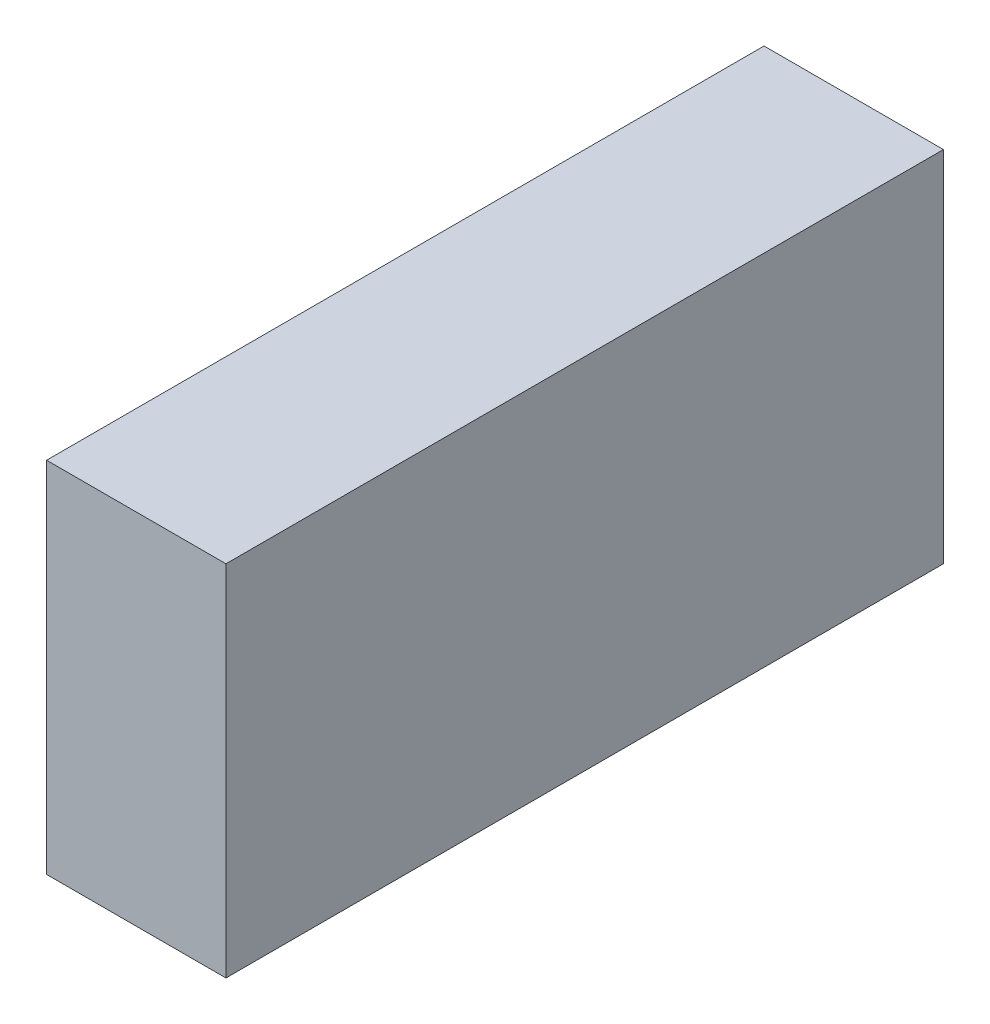
ISO-10303-21;
HEADER;
FILE_DESCRIPTION(('STEP AP214'),'2;1');
FILE_NAME('part.step','',(''),(''),'','','');
FILE_SCHEMA(('AUTOMOTIVE_DESIGN { 1 0 10303 214 1 1 1 1 }'));
ENDSEC;
DATA;
#1=APPLICATION_CONTEXT('core data for automotive mechanical design processes');
#2=APPLICATION_PROTOCOL_DEFINITION('international standard','automotive_design',2000,#1);
#3=PRODUCT_CONTEXT('',#1,'mechanical');
#4=PRODUCT('Part','Part','',(#3));
#5=PRODUCT_RELATED_PRODUCT_CATEGORY('part','',(#4));
#6=PRODUCT_DEFINITION_FORMATION('','',#4);
#7=PRODUCT_DEFINITION_CONTEXT('part definition',#1,'design');
#8=PRODUCT_DEFINITION('design','',#6,#7);
#9=PRODUCT_DEFINITION_SHAPE('','',#8);
#10=(LENGTH_UNIT() NAMED_UNIT(*) SI_UNIT(.MILLI.,.METRE.));
#11=(NAMED_UNIT(*) PLANE_ANGLE_UNIT() SI_UNIT($,.RADIAN.));
#12=(NAMED_UNIT(*) SI_UNIT($,.STERADIAN.) SOLID_ANGLE_UNIT());
#13=UNCERTAINTY_MEASURE_WITH_UNIT(LENGTH_MEASURE(1.E-05),#10,'distance_accuracy_value','');
#14=(GEOMETRIC_REPRESENTATION_CONTEXT(3) GLOBAL_UNCERTAINTY_ASSIGNED_CONTEXT((#13)) GLOBAL_UNIT_ASSIGNED_CONTEXT((#10,
#11,#12)) REPRESENTATION_CONTEXT('',''));
#15=CARTESIAN_POINT('',(0.,0.,0.));
#16=DIRECTION('',(0.,0.,1.));
#17=DIRECTION('',(1.,0.,0.));
#18=AXIS2_PLACEMENT_3D('',#15,#16,#17);
#19=CARTESIAN_POINT('',(-2.70345909952735,1.31542699724518,80.));
#20=DIRECTION('',(1.,0.,0.));
#21=DIRECTION('',(0.,1.,0.));
#22=AXIS2_PLACEMENT_3D('',#19,#20,#21);
#23=PLANE('',#22);
#24=DIRECTION('',(0.,-1.,0.));
#25=VECTOR('',#24,1.);
#26=CARTESIAN_POINT('',(-2.70345909952735,1.31542699724518,0.));
#27=LINE('',#26,#25);
#28=CARTESIAN_POINT('',(-2.70345909952735,1.31542699724518,0.));
#29=VERTEX_POINT('',#28);
#30=CARTESIAN_POINT('',(-2.70345909952735,-38.6845730027548,0.));
#31=VERTEX_POINT('',#30);
#32=EDGE_CURVE('E97',#29,#31,#27,.T.);
#33=ORIENTED_EDGE('',*,*,#32,.T.);
#34=DIRECTION('',(0.,0.,-1.));
#35=VECTOR('',#34,1.);
#36=CARTESIAN_POINT('',(-2.70345909952735,-38.6845730027548,80.));
#37=LINE('',#36,#35);
#38=CARTESIAN_POINT('',(-2.70345909952735,-38.6845730027548,80.));
#39=VERTEX_POINT('',#38);
#40=EDGE_CURVE('E11',#39,#31,#37,.T.);
#41=ORIENTED_EDGE('',*,*,#40,.F.);
#42=DIRECTION('',(0.,-1.,0.));
#43=VECTOR('',#42,1.);
#44=CARTESIAN_POINT('',(-2.70345909952735,1.31542699724518,80.));
#45=LINE('',#44,#43);
#46=CARTESIAN_POINT('',(-2.70345909952735,1.31542699724518,80.));
#47=VERTEX_POINT('',#46);
#48=EDGE_CURVE('E85',#47,#39,#45,.T.);
#49=ORIENTED_EDGE('',*,*,#48,.F.);
#50=DIRECTION('',(0.,0.,-1.));
#51=VECTOR('',#50,1.);
#52=CARTESIAN_POINT('',(-2.70345909952735,1.31542699724518,80.));
#53=LINE('',#52,#51);
#54=EDGE_CURVE('E93',#47,#29,#53,.T.);
#55=ORIENTED_EDGE('',*,*,#54,.T.);
#56=EDGE_LOOP('',(#33,#41,#49,#55));
#57=FACE_BOUND('',#56,.T.);
#58=ADVANCED_FACE('F34',(#57),#23,.F.);
#59=CARTESIAN_POINT('',(-2.70345909952735,-38.6845730027548,80.));
#60=DIRECTION('',(0.,1.,0.));
#61=DIRECTION('',(0.,0.,1.));
#62=AXIS2_PLACEMENT_3D('',#59,#60,#61);
#63=PLANE('',#62);
#64=DIRECTION('',(1.,0.,0.));
#65=VECTOR('',#64,1.);
#66=CARTESIAN_POINT('',(-2.70345909952735,-38.6845730027548,0.));
#67=LINE('',#66,#65);
#68=CARTESIAN_POINT('',(17.2965409004726,-38.6845730027548,0.));
#69=VERTEX_POINT('',#68);
#70=EDGE_CURVE('E89',#31,#69,#67,.T.);
#71=ORIENTED_EDGE('',*,*,#70,.T.);
#72=DIRECTION('',(0.,0.,-1.));
#73=VECTOR('',#72,1.);
#74=CARTESIAN_POINT('',(17.2965409004726,-38.6845730027548,80.));
#75=LINE('',#74,#73);
#76=CARTESIAN_POINT('',(17.2965409004726,-38.6845730027548,80.));
#77=VERTEX_POINT('',#76);
#78=EDGE_CURVE('E42',#77,#69,#75,.T.);
#79=ORIENTED_EDGE('',*,*,#78,.F.);
#80=DIRECTION('',(1.,0.,0.));
#81=VECTOR('',#80,1.);
#82=CARTESIAN_POINT('',(-2.70345909952735,-38.6845730027548,80.));
#83=LINE('',#82,#81);
#84=EDGE_CURVE('E80',#39,#77,#83,.T.);
#85=ORIENTED_EDGE('',*,*,#84,.F.);
#86=ORIENTED_EDGE('',*,*,#40,.T.);
#87=EDGE_LOOP('',(#71,#79,#85,#86));
#88=FACE_BOUND('',#87,.T.);
#89=ADVANCED_FACE('F88',(#88),#63,.F.);
#90=CARTESIAN_POINT('',(17.2965409004726,1.31542699724518,80.));
#91=DIRECTION('',(-1.,0.,0.));
#92=DIRECTION('',(0.,-1.,0.));
#93=AXIS2_PLACEMENT_3D('',#90,#91,#92);
#94=PLANE('',#93);
#95=DIRECTION('',(0.,1.,0.));
#96=VECTOR('',#95,1.);
#97=CARTESIAN_POINT('',(17.2965409004726,1.31542699724518,0.));
#98=LINE('',#97,#96);
#99=CARTESIAN_POINT('',(17.2965409004726,1.31542699724518,0.));
#100=VERTEX_POINT('',#99);
#101=EDGE_CURVE('E67',#69,#100,#98,.T.);
#102=ORIENTED_EDGE('',*,*,#101,.T.);
#103=DIRECTION('',(0.,0.,-1.));
#104=VECTOR('',#103,1.);
#105=CARTESIAN_POINT('',(17.2965409004726,1.31542699724518,80.));
#106=LINE('',#105,#104);
#107=CARTESIAN_POINT('',(17.2965409004726,1.31542699724518,80.));
#108=VERTEX_POINT('',#107);
#109=EDGE_CURVE('E90',#108,#100,#106,.T.);
#110=ORIENTED_EDGE('',*,*,#109,.F.);
#111=DIRECTION('',(0.,1.,0.));
#112=VECTOR('',#111,1.);
#113=CARTESIAN_POINT('',(17.2965409004726,1.31542699724518,80.));
#114=LINE('',#113,#112);
#115=EDGE_CURVE('E83',#77,#108,#114,.T.);
#116=ORIENTED_EDGE('',*,*,#115,.F.);
#117=ORIENTED_EDGE('',*,*,#78,.T.);
#118=EDGE_LOOP('',(#102,#110,#116,#117));
#119=FACE_BOUND('',#118,.T.);
#120=ADVANCED_FACE('F91',(#119),#94,.F.);
#121=CARTESIAN_POINT('',(-2.70345909952735,1.31542699724518,80.));
#122=DIRECTION('',(0.,-1.,0.));
#123=DIRECTION('',(0.,0.,-1.));
#124=AXIS2_PLACEMENT_3D('',#121,#122,#123);
#125=PLANE('',#124);
#126=DIRECTION('',(-1.,0.,0.));
#127=VECTOR('',#126,1.);
#128=CARTESIAN_POINT('',(-2.70345909952735,1.31542699724518,0.));
#129=LINE('',#128,#127);
#130=EDGE_CURVE('E73',#100,#29,#129,.T.);
#131=ORIENTED_EDGE('',*,*,#130,.T.);
#132=ORIENTED_EDGE('',*,*,#54,.F.);
#133=DIRECTION('',(-1.,0.,0.));
#134=VECTOR('',#133,1.);
#135=CARTESIAN_POINT('',(-2.70345909952735,1.31542699724518,80.));
#136=LINE('',#135,#134);
#137=EDGE_CURVE('E50',#108,#47,#136,.T.);
#138=ORIENTED_EDGE('',*,*,#137,.F.);
#139=ORIENTED_EDGE('',*,*,#109,.T.);
#140=EDGE_LOOP('',(#131,#132,#138,#139));
#141=FACE_BOUND('',#140,.T.);
#142=ADVANCED_FACE('F104',(#141),#125,.F.);
#143=CARTESIAN_POINT('',(0.,0.,80.));
#144=DIRECTION('',(0.,0.,1.));
#145=DIRECTION('',(1.,0.,0.));
#146=AXIS2_PLACEMENT_3D('',#143,#144,#145);
#147=PLANE('',#146);
#148=ORIENTED_EDGE('',*,*,#48,.T.);
#149=ORIENTED_EDGE('',*,*,#84,.T.);
#150=ORIENTED_EDGE('',*,*,#115,.T.);
#151=ORIENTED_EDGE('',*,*,#137,.T.);
#152=EDGE_LOOP('',(#148,#149,#150,#151));
#153=FACE_BOUND('',#152,.T.);
#154=ADVANCED_FACE('F81',(#153),#147,.T.);
#155=CARTESIAN_POINT('',(0.,0.,0.));
#156=DIRECTION('',(0.,0.,1.));
#157=DIRECTION('',(1.,0.,0.));
#158=AXIS2_PLACEMENT_3D('',#155,#156,#157);
#159=PLANE('',#158);
#160=ORIENTED_EDGE('',*,*,#32,.F.);
#161=ORIENTED_EDGE('',*,*,#130,.F.);
#162=ORIENTED_EDGE('',*,*,#101,.F.);
#163=ORIENTED_EDGE('',*,*,#70,.F.);
#164=EDGE_LOOP('',(#160,#161,#162,#163));
#165=FACE_BOUND('',#164,.T.);
#166=ADVANCED_FACE('F107',(#165),#159,.F.);
#167=CLOSED_SHELL('',(#58,#89,#120,#142,#154,#166));
#168=MANIFOLD_SOLID_BREP('B2',#167);
#169=ADVANCED_BREP_SHAPE_REPRESENTATION('',(#18,#168),#14);
#170=SHAPE_DEFINITION_REPRESENTATION(#9,#169);
ENDSEC;
END-ISO-10303-21;
